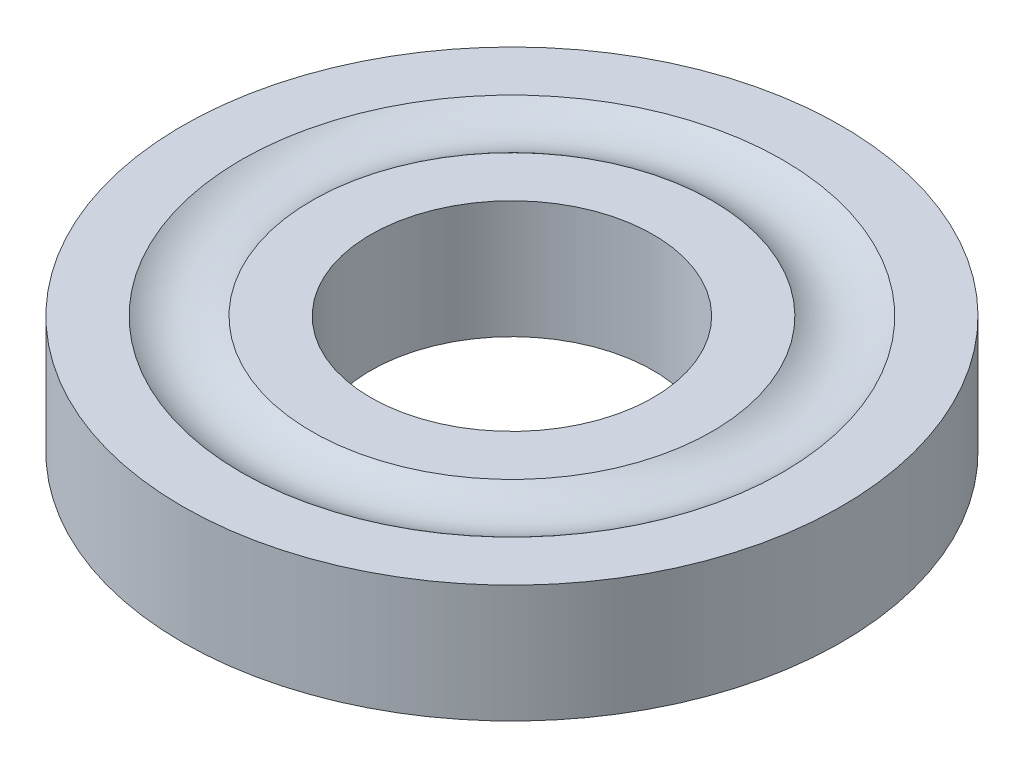
ISO-10303-21;
HEADER;
FILE_DESCRIPTION(('STEP AP214'),'2;1');
FILE_NAME('part.step','',(''),(''),'','','');
FILE_SCHEMA(('AUTOMOTIVE_DESIGN { 1 0 10303 214 1 1 1 1 }'));
ENDSEC;
DATA;
#1=APPLICATION_CONTEXT('core data for automotive mechanical design processes');
#2=APPLICATION_PROTOCOL_DEFINITION('international standard','automotive_design',2000,#1);
#3=PRODUCT_CONTEXT('',#1,'mechanical');
#4=PRODUCT('Part','Part','',(#3));
#5=PRODUCT_RELATED_PRODUCT_CATEGORY('part','',(#4));
#6=PRODUCT_DEFINITION_FORMATION('','',#4);
#7=PRODUCT_DEFINITION_CONTEXT('part definition',#1,'design');
#8=PRODUCT_DEFINITION('design','',#6,#7);
#9=PRODUCT_DEFINITION_SHAPE('','',#8);
#10=(LENGTH_UNIT() NAMED_UNIT(*) SI_UNIT(.MILLI.,.METRE.));
#11=(NAMED_UNIT(*) PLANE_ANGLE_UNIT() SI_UNIT($,.RADIAN.));
#12=(NAMED_UNIT(*) SI_UNIT($,.STERADIAN.) SOLID_ANGLE_UNIT());
#13=UNCERTAINTY_MEASURE_WITH_UNIT(LENGTH_MEASURE(1.E-05),#10,'distance_accuracy_value','');
#14=(GEOMETRIC_REPRESENTATION_CONTEXT(3) GLOBAL_UNCERTAINTY_ASSIGNED_CONTEXT((#13)) GLOBAL_UNIT_ASSIGNED_CONTEXT((#10,
#11,#12)) REPRESENTATION_CONTEXT('',''));
#15=CARTESIAN_POINT('',(0.,0.,0.));
#16=DIRECTION('',(0.,0.,1.));
#17=DIRECTION('',(1.,0.,0.));
#18=AXIS2_PLACEMENT_3D('',#15,#16,#17);
#19=CARTESIAN_POINT('',(0.,1.25,0.));
#20=DIRECTION('',(0.,1.,0.));
#21=DIRECTION('',(0.,0.,1.));
#22=AXIS2_PLACEMENT_3D('',#19,#20,#21);
#23=PLANE('',#22);
#24=CARTESIAN_POINT('',(0.,1.25,0.));
#25=DIRECTION('',(0.,1.,0.));
#26=DIRECTION('',(0.,0.,1.));
#27=AXIS2_PLACEMENT_3D('',#24,#25,#26);
#28=CIRCLE('',#27,3.5);
#29=CARTESIAN_POINT('',(0.,1.25,3.5));
#30=VERTEX_POINT('',#29);
#31=EDGE_CURVE('E10',#30,#30,#28,.T.);
#32=ORIENTED_EDGE('',*,*,#31,.T.);
#33=EDGE_LOOP('',(#32));
#34=FACE_BOUND('',#33,.T.);
#35=CARTESIAN_POINT('',(0.,1.25,0.));
#36=DIRECTION('',(0.,1.,0.));
#37=DIRECTION('',(0.,0.,1.));
#38=AXIS2_PLACEMENT_3D('',#35,#36,#37);
#39=CIRCLE('',#38,2.875);
#40=CARTESIAN_POINT('',(0.,1.25,2.875));
#41=VERTEX_POINT('',#40);
#42=EDGE_CURVE('E40',#41,#41,#39,.F.);
#43=ORIENTED_EDGE('',*,*,#42,.T.);
#44=EDGE_LOOP('',(#43));
#45=FACE_BOUND('',#44,.T.);
#46=ADVANCED_FACE('F36',(#34,#45),#23,.T.);
#47=CARTESIAN_POINT('',(0.,1.25,0.));
#48=DIRECTION('',(0.,1.,0.));
#49=DIRECTION('',(0.,0.,1.));
#50=AXIS2_PLACEMENT_3D('',#47,#48,#49);
#51=CIRCLE('',#50,1.5);
#52=CARTESIAN_POINT('',(0.,1.25,1.5));
#53=VERTEX_POINT('',#52);
#54=EDGE_CURVE('E52',#53,#53,#51,.T.);
#55=ORIENTED_EDGE('',*,*,#54,.F.);
#56=EDGE_LOOP('',(#55));
#57=FACE_BOUND('',#56,.T.);
#58=CARTESIAN_POINT('',(0.,1.25,0.));
#59=DIRECTION('',(0.,-1.,0.));
#60=DIRECTION('',(0.,0.,-1.));
#61=AXIS2_PLACEMENT_3D('',#58,#59,#60);
#62=CIRCLE('',#61,2.125);
#63=CARTESIAN_POINT('',(0.,1.25,-2.125));
#64=VERTEX_POINT('',#63);
#65=EDGE_CURVE('E57',#64,#64,#62,.F.);
#66=ORIENTED_EDGE('',*,*,#65,.T.);
#67=EDGE_LOOP('',(#66));
#68=FACE_BOUND('',#67,.T.);
#69=ADVANCED_FACE('F76',(#57,#68),#23,.T.);
#70=CARTESIAN_POINT('',(0.,0.,0.));
#71=DIRECTION('',(0.,1.,0.));
#72=DIRECTION('',(0.,0.,1.));
#73=AXIS2_PLACEMENT_3D('',#70,#71,#72);
#74=PLANE('',#73);
#75=CARTESIAN_POINT('',(0.,0.,0.));
#76=DIRECTION('',(0.,1.,0.));
#77=DIRECTION('',(0.,0.,1.));
#78=AXIS2_PLACEMENT_3D('',#75,#76,#77);
#79=CIRCLE('',#78,3.5);
#80=CARTESIAN_POINT('',(0.,0.,3.5));
#81=VERTEX_POINT('',#80);
#82=EDGE_CURVE('E45',#81,#81,#79,.T.);
#83=ORIENTED_EDGE('',*,*,#82,.F.);
#84=EDGE_LOOP('',(#83));
#85=FACE_BOUND('',#84,.T.);
#86=CARTESIAN_POINT('',(0.,0.,0.));
#87=DIRECTION('',(0.,1.,0.));
#88=DIRECTION('',(0.,0.,1.));
#89=AXIS2_PLACEMENT_3D('',#86,#87,#88);
#90=CIRCLE('',#89,1.5);
#91=CARTESIAN_POINT('',(0.,0.,1.5));
#92=VERTEX_POINT('',#91);
#93=EDGE_CURVE('E55',#92,#92,#90,.T.);
#94=ORIENTED_EDGE('',*,*,#93,.T.);
#95=EDGE_LOOP('',(#94));
#96=FACE_BOUND('',#95,.T.);
#97=ADVANCED_FACE('F78',(#85,#96),#74,.F.);
#98=CARTESIAN_POINT('',(0.,1.25,0.));
#99=DIRECTION('',(0.,-1.,0.));
#100=DIRECTION('',(0.,0.,-1.));
#101=AXIS2_PLACEMENT_3D('',#98,#99,#100);
#102=CYLINDRICAL_SURFACE('',#101,3.5);
#103=ORIENTED_EDGE('',*,*,#31,.F.);
#104=EDGE_LOOP('',(#103));
#105=FACE_BOUND('',#104,.T.);
#106=ORIENTED_EDGE('',*,*,#82,.T.);
#107=EDGE_LOOP('',(#106));
#108=FACE_BOUND('',#107,.T.);
#109=ADVANCED_FACE('F38',(#105,#108),#102,.T.);
#110=CARTESIAN_POINT('',(0.,1.25,0.));
#111=DIRECTION('',(0.,-1.,0.));
#112=DIRECTION('',(0.,0.,-1.));
#113=AXIS2_PLACEMENT_3D('',#110,#111,#112);
#114=CYLINDRICAL_SURFACE('',#113,1.5);
#115=ORIENTED_EDGE('',*,*,#54,.T.);
#116=EDGE_LOOP('',(#115));
#117=FACE_BOUND('',#116,.T.);
#118=ORIENTED_EDGE('',*,*,#93,.F.);
#119=EDGE_LOOP('',(#118));
#120=FACE_BOUND('',#119,.T.);
#121=ADVANCED_FACE('F73',(#117,#120),#114,.F.);
#122=CARTESIAN_POINT('',(0.,1.75,0.));
#123=DIRECTION('',(0.,-1.,0.));
#124=DIRECTION('',(0.,0.,-1.));
#125=AXIS2_PLACEMENT_3D('',#122,#123,#124);
#126=TOROIDAL_SURFACE('',#125,2.5,0.625);
#127=ORIENTED_EDGE('',*,*,#42,.F.);
#128=EDGE_LOOP('',(#127));
#129=FACE_BOUND('',#128,.T.);
#130=ORIENTED_EDGE('',*,*,#65,.F.);
#131=EDGE_LOOP('',(#130));
#132=FACE_BOUND('',#131,.T.);
#133=ADVANCED_FACE('F88',(#129,#132),#126,.F.);
#134=CLOSED_SHELL('',(#46,#69,#97,#109,#121,#133));
#135=MANIFOLD_SOLID_BREP('B2',#134);
#136=ADVANCED_BREP_SHAPE_REPRESENTATION('',(#18,#135),#14);
#137=SHAPE_DEFINITION_REPRESENTATION(#9,#136);
ENDSEC;
END-ISO-10303-21;
